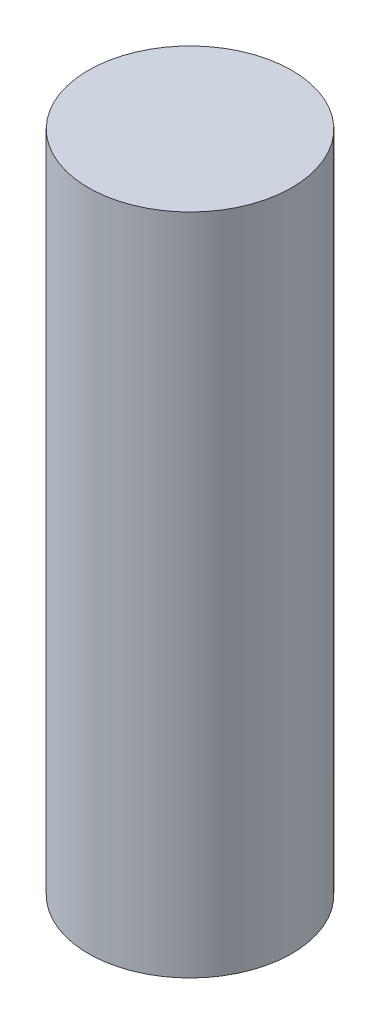
ISO-10303-21;
HEADER;
FILE_DESCRIPTION(('STEP AP214'),'2;1');
FILE_NAME('part.step','',(''),(''),'','','');
FILE_SCHEMA(('AUTOMOTIVE_DESIGN { 1 0 10303 214 1 1 1 1 }'));
ENDSEC;
DATA;
#1=APPLICATION_CONTEXT('core data for automotive mechanical design processes');
#2=APPLICATION_PROTOCOL_DEFINITION('international standard','automotive_design',2000,#1);
#3=PRODUCT_CONTEXT('',#1,'mechanical');
#4=PRODUCT('Part','Part','',(#3));
#5=PRODUCT_RELATED_PRODUCT_CATEGORY('part','',(#4));
#6=PRODUCT_DEFINITION_FORMATION('','',#4);
#7=PRODUCT_DEFINITION_CONTEXT('part definition',#1,'design');
#8=PRODUCT_DEFINITION('design','',#6,#7);
#9=PRODUCT_DEFINITION_SHAPE('','',#8);
#10=(LENGTH_UNIT() NAMED_UNIT(*) SI_UNIT(.MILLI.,.METRE.));
#11=(NAMED_UNIT(*) PLANE_ANGLE_UNIT() SI_UNIT($,.RADIAN.));
#12=(NAMED_UNIT(*) SI_UNIT($,.STERADIAN.) SOLID_ANGLE_UNIT());
#13=UNCERTAINTY_MEASURE_WITH_UNIT(LENGTH_MEASURE(1.E-05),#10,'distance_accuracy_value','');
#14=(GEOMETRIC_REPRESENTATION_CONTEXT(3) GLOBAL_UNCERTAINTY_ASSIGNED_CONTEXT((#13)) GLOBAL_UNIT_ASSIGNED_CONTEXT((#10,
#11,#12)) REPRESENTATION_CONTEXT('',''));
#15=CARTESIAN_POINT('',(0.,0.,0.));
#16=DIRECTION('',(0.,0.,1.));
#17=DIRECTION('',(1.,0.,0.));
#18=AXIS2_PLACEMENT_3D('',#15,#16,#17);
#19=CARTESIAN_POINT('',(0.,19.05,0.));
#20=DIRECTION('',(0.,-1.,0.));
#21=DIRECTION('',(0.,0.,-1.));
#22=AXIS2_PLACEMENT_3D('',#19,#20,#21);
#23=CYLINDRICAL_SURFACE('',#22,2.921);
#24=CARTESIAN_POINT('',(0.,19.05,0.));
#25=DIRECTION('',(0.,1.,0.));
#26=DIRECTION('',(0.,0.,1.));
#27=AXIS2_PLACEMENT_3D('',#24,#25,#26);
#28=CIRCLE('',#27,2.921);
#29=CARTESIAN_POINT('',(0.,19.05,-2.921));
#30=VERTEX_POINT('',#29);
#31=EDGE_CURVE('E10',#30,#30,#28,.T.);
#32=CARTESIAN_POINT('',(0.,0.,0.));
#33=DIRECTION('',(0.,1.,0.));
#34=DIRECTION('',(0.,0.,1.));
#35=AXIS2_PLACEMENT_3D('',#32,#33,#34);
#36=CIRCLE('',#35,2.921);
#37=CARTESIAN_POINT('',(0.,0.,-2.921));
#38=VERTEX_POINT('',#37);
#39=EDGE_CURVE('E34',#38,#38,#36,.T.);
#40=CARTESIAN_POINT('',(0.,19.05,-2.921));
#41=CARTESIAN_POINT('',(0.,18.8515625,-2.921));
#42=CARTESIAN_POINT('',(0.,18.653125,-2.921));
#43=CARTESIAN_POINT('',(0.,18.25625,-2.921));
#44=CARTESIAN_POINT('',(0.,18.0578125,-2.921));
#45=CARTESIAN_POINT('',(0.,17.6609375,-2.921));
#46=CARTESIAN_POINT('',(0.,17.4625,-2.921));
#47=CARTESIAN_POINT('',(0.,17.065625,-2.921));
#48=CARTESIAN_POINT('',(0.,16.8671875,-2.921));
#49=CARTESIAN_POINT('',(0.,16.4703125,-2.921));
#50=CARTESIAN_POINT('',(0.,16.271875,-2.921));
#51=CARTESIAN_POINT('',(0.,15.875,-2.921));
#52=CARTESIAN_POINT('',(0.,15.6765625,-2.921));
#53=CARTESIAN_POINT('',(0.,15.2796875,-2.921));
#54=CARTESIAN_POINT('',(0.,15.08125,-2.921));
#55=CARTESIAN_POINT('',(0.,14.684375,-2.921));
#56=CARTESIAN_POINT('',(0.,14.4859375,-2.921));
#57=CARTESIAN_POINT('',(0.,14.0890625,-2.921));
#58=CARTESIAN_POINT('',(0.,13.890625,-2.921));
#59=CARTESIAN_POINT('',(0.,13.49375,-2.921));
#60=CARTESIAN_POINT('',(0.,13.2953125,-2.921));
#61=CARTESIAN_POINT('',(0.,12.8984375,-2.921));
#62=CARTESIAN_POINT('',(0.,12.7,-2.921));
#63=CARTESIAN_POINT('',(0.,12.303125,-2.921));
#64=CARTESIAN_POINT('',(0.,12.1046875,-2.921));
#65=CARTESIAN_POINT('',(0.,11.7078125,-2.921));
#66=CARTESIAN_POINT('',(0.,11.509375,-2.921));
#67=CARTESIAN_POINT('',(0.,11.1125,-2.921));
#68=CARTESIAN_POINT('',(0.,10.9140625,-2.921));
#69=CARTESIAN_POINT('',(0.,10.5171875,-2.921));
#70=CARTESIAN_POINT('',(0.,10.31875,-2.921));
#71=CARTESIAN_POINT('',(0.,9.921875,-2.921));
#72=CARTESIAN_POINT('',(0.,9.7234375,-2.921));
#73=CARTESIAN_POINT('',(0.,9.3265625,-2.921));
#74=CARTESIAN_POINT('',(0.,9.128125,-2.921));
#75=CARTESIAN_POINT('',(0.,8.73125,-2.921));
#76=CARTESIAN_POINT('',(0.,8.5328125,-2.921));
#77=CARTESIAN_POINT('',(0.,8.1359375,-2.921));
#78=CARTESIAN_POINT('',(0.,7.9375,-2.921));
#79=CARTESIAN_POINT('',(0.,7.540625,-2.921));
#80=CARTESIAN_POINT('',(0.,7.3421875,-2.921));
#81=CARTESIAN_POINT('',(0.,6.9453125,-2.921));
#82=CARTESIAN_POINT('',(0.,6.746875,-2.921));
#83=CARTESIAN_POINT('',(0.,6.35,-2.921));
#84=CARTESIAN_POINT('',(0.,6.1515625,-2.921));
#85=CARTESIAN_POINT('',(0.,5.7546875,-2.921));
#86=CARTESIAN_POINT('',(0.,5.55625,-2.921));
#87=CARTESIAN_POINT('',(0.,5.159375,-2.921));
#88=CARTESIAN_POINT('',(0.,4.9609375,-2.921));
#89=CARTESIAN_POINT('',(0.,4.5640625,-2.921));
#90=CARTESIAN_POINT('',(0.,4.365625,-2.921));
#91=CARTESIAN_POINT('',(0.,3.96875,-2.921));
#92=CARTESIAN_POINT('',(0.,3.7703125,-2.921));
#93=CARTESIAN_POINT('',(0.,3.3734375,-2.921));
#94=CARTESIAN_POINT('',(0.,3.175,-2.921));
#95=CARTESIAN_POINT('',(0.,2.778125,-2.921));
#96=CARTESIAN_POINT('',(0.,2.5796875,-2.921));
#97=CARTESIAN_POINT('',(0.,2.1828125,-2.921));
#98=CARTESIAN_POINT('',(0.,1.984375,-2.921));
#99=CARTESIAN_POINT('',(0.,1.5875,-2.921));
#100=CARTESIAN_POINT('',(0.,1.3890625,-2.921));
#101=CARTESIAN_POINT('',(0.,0.992187500000001,-2.921));
#102=CARTESIAN_POINT('',(0.,0.793750000000001,-2.921));
#103=CARTESIAN_POINT('',(0.,0.396875,-2.921));
#104=CARTESIAN_POINT('',(0.,0.1984375,-2.921));
#105=CARTESIAN_POINT('',(0.,0.,-2.921));
#106=B_SPLINE_CURVE_WITH_KNOTS('',3,(#40,#41,#42,#43,#44,#45,#46,#47,#48,#49,#50,#51,#52,#53,
#54,#55,#56,#57,#58,#59,#60,#61,#62,#63,#64,#65,#66,#67,#68,#69,#70,#71,#72,#73,#74,#75,#76,#77,
#78,#79,#80,#81,#82,#83,#84,#85,#86,#87,#88,#89,#90,#91,#92,#93,#94,#95,#96,#97,#98,#99,#100,
#101,#102,#103,#104,#105),.UNSPECIFIED.,.F.,.F.,(4,2,2,2,2,2,2,2,2,2,2,2,2,2,2,2,2,2,2,2,2,2,2,
2,2,2,2,2,2,2,2,2,4),(0.,0.5953125,1.190625,1.7859375,2.38125,2.9765625,3.571875,4.1671875,
4.7625,5.3578125,5.953125,6.5484375,7.14375,7.7390625,8.334375,8.9296875,9.525,10.1203125,
10.715625,11.3109375,11.90625,12.5015625,13.096875,13.6921875,14.2875,14.8828125,15.478125,
16.0734375,16.66875,17.2640625,17.859375,18.4546875,19.05),.UNSPECIFIED.);
#107=EDGE_CURVE('BSEAM31',#30,#38,#106,.T.);
#108=ORIENTED_EDGE('',*,*,#31,.F.);
#109=ORIENTED_EDGE('',*,*,#39,.T.);
#110=ORIENTED_EDGE('',*,*,#107,.T.);
#111=ORIENTED_EDGE('',*,*,#107,.F.);
#112=EDGE_LOOP('',(#108,#110,#109,#111));
#113=FACE_BOUND('',#112,.T.);
#114=ADVANCED_FACE('F31',(#113),#23,.T.);
#115=CARTESIAN_POINT('',(0.,19.05,0.));
#116=DIRECTION('',(0.,1.,0.));
#117=DIRECTION('',(0.,0.,1.));
#118=AXIS2_PLACEMENT_3D('',#115,#116,#117);
#119=PLANE('',#118);
#120=ORIENTED_EDGE('',*,*,#31,.T.);
#121=EDGE_LOOP('',(#120));
#122=FACE_BOUND('',#121,.T.);
#123=ADVANCED_FACE('F46',(#122),#119,.T.);
#124=CARTESIAN_POINT('',(0.,0.,0.));
#125=DIRECTION('',(0.,1.,0.));
#126=DIRECTION('',(0.,0.,1.));
#127=AXIS2_PLACEMENT_3D('',#124,#125,#126);
#128=PLANE('',#127);
#129=ORIENTED_EDGE('',*,*,#39,.F.);
#130=EDGE_LOOP('',(#129));
#131=FACE_BOUND('',#130,.T.);
#132=ADVANCED_FACE('F44',(#131),#128,.F.);
#133=CLOSED_SHELL('',(#114,#123,#132));
#134=MANIFOLD_SOLID_BREP('B2',#133);
#135=ADVANCED_BREP_SHAPE_REPRESENTATION('',(#18,#134),#14);
#136=SHAPE_DEFINITION_REPRESENTATION(#9,#135);
ENDSEC;
END-ISO-10303-21;
